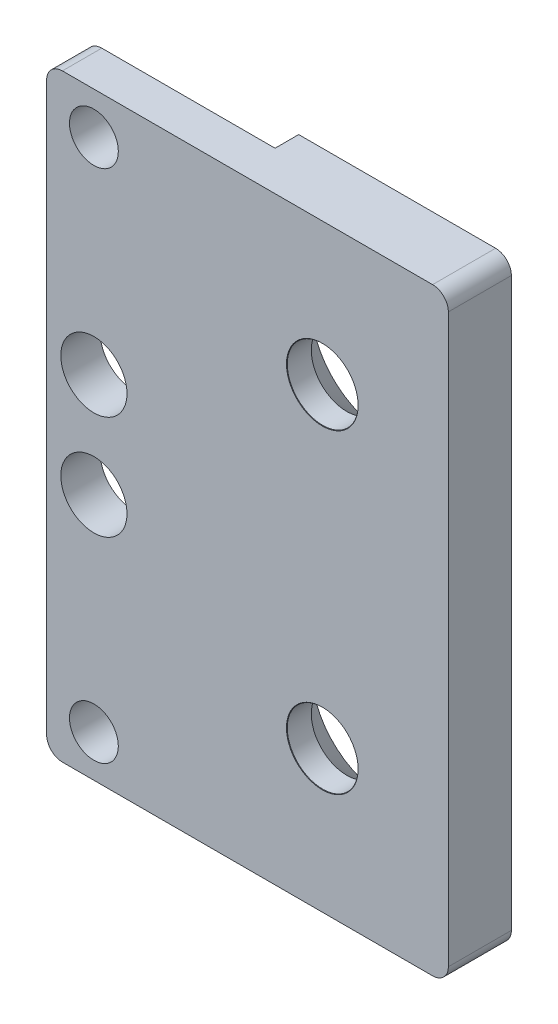
ISO-10303-21;
HEADER;
FILE_DESCRIPTION(('STEP AP214'),'2;1');
FILE_NAME('part.step','',(''),(''),'','','');
FILE_SCHEMA(('AUTOMOTIVE_DESIGN { 1 0 10303 214 1 1 1 1 }'));
ENDSEC;
DATA;
#1=APPLICATION_CONTEXT('core data for automotive mechanical design processes');
#2=APPLICATION_PROTOCOL_DEFINITION('international standard','automotive_design',2000,#1);
#3=PRODUCT_CONTEXT('',#1,'mechanical');
#4=PRODUCT('Part','Part','',(#3));
#5=PRODUCT_RELATED_PRODUCT_CATEGORY('part','',(#4));
#6=PRODUCT_DEFINITION_FORMATION('','',#4);
#7=PRODUCT_DEFINITION_CONTEXT('part definition',#1,'design');
#8=PRODUCT_DEFINITION('design','',#6,#7);
#9=PRODUCT_DEFINITION_SHAPE('','',#8);
#10=(LENGTH_UNIT() NAMED_UNIT(*) SI_UNIT(.MILLI.,.METRE.));
#11=(NAMED_UNIT(*) PLANE_ANGLE_UNIT() SI_UNIT($,.RADIAN.));
#12=(NAMED_UNIT(*) SI_UNIT($,.STERADIAN.) SOLID_ANGLE_UNIT());
#13=UNCERTAINTY_MEASURE_WITH_UNIT(LENGTH_MEASURE(1.E-05),#10,'distance_accuracy_value','');
#14=(GEOMETRIC_REPRESENTATION_CONTEXT(3) GLOBAL_UNCERTAINTY_ASSIGNED_CONTEXT((#13)) GLOBAL_UNIT_ASSIGNED_CONTEXT((#10,
#11,#12)) REPRESENTATION_CONTEXT('',''));
#15=CARTESIAN_POINT('',(0.,0.,0.));
#16=DIRECTION('',(0.,0.,1.));
#17=DIRECTION('',(1.,0.,0.));
#18=AXIS2_PLACEMENT_3D('',#15,#16,#17);
#19=CARTESIAN_POINT('',(-12.75,-19.001,1.5));
#20=DIRECTION('',(0.,0.,1.));
#21=DIRECTION('',(1.,0.,0.));
#22=AXIS2_PLACEMENT_3D('',#19,#20,#21);
#23=PLANE('',#22);
#24=CARTESIAN_POINT('',(-9.75,-3.3,1.5));
#25=DIRECTION('',(0.,0.,-1.));
#26=DIRECTION('',(-1.,0.,0.));
#27=AXIS2_PLACEMENT_3D('',#24,#25,#26);
#28=CIRCLE('',#27,2.10000000000001);
#29=CARTESIAN_POINT('',(-11.85,-3.3,1.5));
#30=VERTEX_POINT('',#29);
#31=EDGE_CURVE('E349',#30,#30,#28,.T.);
#32=ORIENTED_EDGE('',*,*,#31,.F.);
#33=EDGE_LOOP('',(#32));
#34=FACE_BOUND('',#33,.T.);
#35=CARTESIAN_POINT('',(-9.75,-16.35,1.5));
#36=DIRECTION('',(0.,0.,-1.));
#37=DIRECTION('',(-1.,0.,0.));
#38=AXIS2_PLACEMENT_3D('',#35,#36,#37);
#39=CIRCLE('',#38,1.55);
#40=CARTESIAN_POINT('',(-11.3,-16.35,1.5));
#41=VERTEX_POINT('',#40);
#42=EDGE_CURVE('E337',#41,#41,#39,.T.);
#43=ORIENTED_EDGE('',*,*,#42,.F.);
#44=EDGE_LOOP('',(#43));
#45=FACE_BOUND('',#44,.T.);
#46=CARTESIAN_POINT('',(-9.74999999999999,16.35,1.5));
#47=DIRECTION('',(0.,0.,-1.));
#48=DIRECTION('',(-1.,0.,0.));
#49=AXIS2_PLACEMENT_3D('',#46,#47,#48);
#50=CIRCLE('',#49,1.55);
#51=CARTESIAN_POINT('',(-11.3,16.35,1.5));
#52=VERTEX_POINT('',#51);
#53=EDGE_CURVE('E331',#52,#52,#50,.T.);
#54=ORIENTED_EDGE('',*,*,#53,.F.);
#55=EDGE_LOOP('',(#54));
#56=FACE_BOUND('',#55,.T.);
#57=DIRECTION('',(-1.,0.,0.));
#58=VECTOR('',#57,1.);
#59=CARTESIAN_POINT('',(-12.75,-19.,1.5));
#60=LINE('',#59,#58);
#61=CARTESIAN_POINT('',(-0.75,-19.,1.5));
#62=VERTEX_POINT('',#61);
#63=CARTESIAN_POINT('',(-11.75,-19.,1.5));
#64=VERTEX_POINT('',#63);
#65=EDGE_CURVE('E144',#62,#64,#60,.T.);
#66=ORIENTED_EDGE('',*,*,#65,.T.);
#67=CARTESIAN_POINT('',(-11.75,-18.,1.5));
#68=DIRECTION('',(0.,0.,1.));
#69=DIRECTION('',(1.,0.,0.));
#70=AXIS2_PLACEMENT_3D('',#67,#68,#69);
#71=CIRCLE('',#70,1.);
#72=CARTESIAN_POINT('',(-12.75,-18.,1.5));
#73=VERTEX_POINT('',#72);
#74=EDGE_CURVE('E171',#64,#73,#71,.F.);
#75=ORIENTED_EDGE('',*,*,#74,.T.);
#76=DIRECTION('',(0.,1.,0.));
#77=VECTOR('',#76,1.);
#78=CARTESIAN_POINT('',(-12.75,-19.001,1.5));
#79=LINE('',#78,#77);
#80=CARTESIAN_POINT('',(-12.75,18.,1.5));
#81=VERTEX_POINT('',#80);
#82=EDGE_CURVE('E135',#73,#81,#79,.T.);
#83=ORIENTED_EDGE('',*,*,#82,.T.);
#84=CARTESIAN_POINT('',(-11.75,18.,1.5));
#85=DIRECTION('',(0.,0.,1.));
#86=DIRECTION('',(1.,0.,0.));
#87=AXIS2_PLACEMENT_3D('',#84,#85,#86);
#88=CIRCLE('',#87,1.);
#89=CARTESIAN_POINT('',(-11.75,19.,1.5));
#90=VERTEX_POINT('',#89);
#91=EDGE_CURVE('E121',#81,#90,#88,.F.);
#92=ORIENTED_EDGE('',*,*,#91,.T.);
#93=DIRECTION('',(1.,0.,0.));
#94=VECTOR('',#93,1.);
#95=CARTESIAN_POINT('',(-12.75,19.,1.5));
#96=LINE('',#95,#94);
#97=CARTESIAN_POINT('',(-0.75,19.,1.5));
#98=VERTEX_POINT('',#97);
#99=EDGE_CURVE('E114',#90,#98,#96,.T.);
#100=ORIENTED_EDGE('',*,*,#99,.T.);
#101=DIRECTION('',(0.,1.,0.));
#102=VECTOR('',#101,1.);
#103=CARTESIAN_POINT('',(-0.75,-19.001,1.5));
#104=LINE('',#103,#102);
#105=EDGE_CURVE('E118',#62,#98,#104,.T.);
#106=ORIENTED_EDGE('',*,*,#105,.F.);
#107=EDGE_LOOP('',(#66,#75,#83,#92,#100,#106));
#108=FACE_BOUND('',#107,.T.);
#109=CARTESIAN_POINT('',(-9.75,3.3,1.5));
#110=DIRECTION('',(0.,0.,-1.));
#111=DIRECTION('',(-1.,0.,0.));
#112=AXIS2_PLACEMENT_3D('',#109,#110,#111);
#113=CIRCLE('',#112,2.10000000000001);
#114=CARTESIAN_POINT('',(-11.85,3.3,1.5));
#115=VERTEX_POINT('',#114);
#116=EDGE_CURVE('E343',#115,#115,#113,.T.);
#117=ORIENTED_EDGE('',*,*,#116,.F.);
#118=EDGE_LOOP('',(#117));
#119=FACE_BOUND('',#118,.T.);
#120=ADVANCED_FACE('F37',(#34,#45,#56,#108,#119),#23,.F.);
#121=CARTESIAN_POINT('',(0.,0.,0.));
#122=DIRECTION('',(0.,0.,1.));
#123=DIRECTION('',(1.,0.,0.));
#124=AXIS2_PLACEMENT_3D('',#121,#122,#123);
#125=PLANE('',#124);
#126=DIRECTION('',(-1.,0.,0.));
#127=VECTOR('',#126,1.);
#128=CARTESIAN_POINT('',(12.75,19.,0.));
#129=LINE('',#128,#127);
#130=CARTESIAN_POINT('',(11.75,19.,0.));
#131=VERTEX_POINT('',#130);
#132=CARTESIAN_POINT('',(-0.749999999999999,19.,0.));
#133=VERTEX_POINT('',#132);
#134=EDGE_CURVE('E139',#131,#133,#129,.T.);
#135=ORIENTED_EDGE('',*,*,#134,.F.);
#136=CARTESIAN_POINT('',(11.75,18.,0.));
#137=DIRECTION('',(0.,0.,1.));
#138=DIRECTION('',(1.,0.,0.));
#139=AXIS2_PLACEMENT_3D('',#136,#137,#138);
#140=CIRCLE('',#139,1.);
#141=CARTESIAN_POINT('',(12.75,18.,0.));
#142=VERTEX_POINT('',#141);
#143=EDGE_CURVE('E52',#131,#142,#140,.F.);
#144=ORIENTED_EDGE('',*,*,#143,.T.);
#145=DIRECTION('',(0.,1.,0.));
#146=VECTOR('',#145,1.);
#147=CARTESIAN_POINT('',(12.75,-19.,0.));
#148=LINE('',#147,#146);
#149=CARTESIAN_POINT('',(12.75,-18.,0.));
#150=VERTEX_POINT('',#149);
#151=EDGE_CURVE('E163',#150,#142,#148,.T.);
#152=ORIENTED_EDGE('',*,*,#151,.F.);
#153=CARTESIAN_POINT('',(11.75,-18.,0.));
#154=DIRECTION('',(0.,0.,1.));
#155=DIRECTION('',(1.,0.,0.));
#156=AXIS2_PLACEMENT_3D('',#153,#154,#155);
#157=CIRCLE('',#156,1.);
#158=CARTESIAN_POINT('',(11.75,-19.,0.));
#159=VERTEX_POINT('',#158);
#160=EDGE_CURVE('E60',#150,#159,#157,.F.);
#161=ORIENTED_EDGE('',*,*,#160,.T.);
#162=DIRECTION('',(1.,0.,0.));
#163=VECTOR('',#162,1.);
#164=CARTESIAN_POINT('',(12.75,-19.,0.));
#165=LINE('',#164,#163);
#166=CARTESIAN_POINT('',(-0.75,-19.,0.));
#167=VERTEX_POINT('',#166);
#168=EDGE_CURVE('E147',#167,#159,#165,.T.);
#169=ORIENTED_EDGE('',*,*,#168,.F.);
#170=DIRECTION('',(0.,1.,0.));
#171=VECTOR('',#170,1.);
#172=CARTESIAN_POINT('',(-0.75,-19.001,0.));
#173=LINE('',#172,#171);
#174=EDGE_CURVE('E134',#167,#133,#173,.T.);
#175=ORIENTED_EDGE('',*,*,#174,.T.);
#176=EDGE_LOOP('',(#135,#144,#152,#161,#169,#175));
#177=FACE_BOUND('',#176,.T.);
#178=CARTESIAN_POINT('',(4.75,-10.,0.));
#179=DIRECTION('',(0.,0.,-1.));
#180=DIRECTION('',(-1.,0.,0.));
#181=AXIS2_PLACEMENT_3D('',#178,#179,#180);
#182=CIRCLE('',#181,4.7);
#183=CARTESIAN_POINT('',(0.0500000000000014,-10.,0.));
#184=VERTEX_POINT('',#183);
#185=EDGE_CURVE('E310',#184,#184,#182,.T.);
#186=ORIENTED_EDGE('',*,*,#185,.F.);
#187=EDGE_LOOP('',(#186));
#188=FACE_BOUND('',#187,.T.);
#189=CARTESIAN_POINT('',(4.75,10.,0.));
#190=DIRECTION('',(0.,0.,-1.));
#191=DIRECTION('',(-1.,0.,0.));
#192=AXIS2_PLACEMENT_3D('',#189,#190,#191);
#193=CIRCLE('',#192,4.7);
#194=CARTESIAN_POINT('',(0.0500000000000014,10.,0.));
#195=VERTEX_POINT('',#194);
#196=EDGE_CURVE('E322',#195,#195,#193,.T.);
#197=ORIENTED_EDGE('',*,*,#196,.F.);
#198=EDGE_LOOP('',(#197));
#199=FACE_BOUND('',#198,.T.);
#200=ADVANCED_FACE('F196',(#177,#188,#199),#125,.F.);
#201=CARTESIAN_POINT('',(-12.75,-19.,4.));
#202=DIRECTION('',(1.,0.,0.));
#203=DIRECTION('',(0.,0.,-1.));
#204=AXIS2_PLACEMENT_3D('',#201,#202,#203);
#205=PLANE('',#204);
#206=ORIENTED_EDGE('',*,*,#82,.F.);
#207=DIRECTION('',(0.,0.,-1.));
#208=VECTOR('',#207,1.);
#209=CARTESIAN_POINT('',(-12.75,-18.,4.));
#210=LINE('',#209,#208);
#211=CARTESIAN_POINT('',(-12.75,-18.,4.));
#212=VERTEX_POINT('',#211);
#213=EDGE_CURVE('E176',#73,#212,#210,.F.);
#214=ORIENTED_EDGE('',*,*,#213,.T.);
#215=DIRECTION('',(0.,-1.,0.));
#216=VECTOR('',#215,1.);
#217=CARTESIAN_POINT('',(-12.75,-19.,4.));
#218=LINE('',#217,#216);
#219=CARTESIAN_POINT('',(-12.75,18.,4.));
#220=VERTEX_POINT('',#219);
#221=EDGE_CURVE('E148',#220,#212,#218,.T.);
#222=ORIENTED_EDGE('',*,*,#221,.F.);
#223=DIRECTION('',(0.,0.,-1.));
#224=VECTOR('',#223,1.);
#225=CARTESIAN_POINT('',(-12.75,18.,4.));
#226=LINE('',#225,#224);
#227=EDGE_CURVE('E173',#220,#81,#226,.T.);
#228=ORIENTED_EDGE('',*,*,#227,.T.);
#229=EDGE_LOOP('',(#206,#214,#222,#228));
#230=FACE_BOUND('',#229,.T.);
#231=ADVANCED_FACE('F212',(#230),#205,.F.);
#232=CARTESIAN_POINT('',(12.75,-19.,4.));
#233=DIRECTION('',(0.,1.,0.));
#234=DIRECTION('',(-1.,0.,0.));
#235=AXIS2_PLACEMENT_3D('',#232,#233,#234);
#236=PLANE('',#235);
#237=DIRECTION('',(1.,0.,0.));
#238=VECTOR('',#237,1.);
#239=CARTESIAN_POINT('',(12.75,-19.,4.));
#240=LINE('',#239,#238);
#241=CARTESIAN_POINT('',(-11.75,-19.,4.));
#242=VERTEX_POINT('',#241);
#243=CARTESIAN_POINT('',(11.75,-19.,4.));
#244=VERTEX_POINT('',#243);
#245=EDGE_CURVE('E151',#242,#244,#240,.T.);
#246=ORIENTED_EDGE('',*,*,#245,.F.);
#247=DIRECTION('',(0.,0.,-1.));
#248=VECTOR('',#247,1.);
#249=CARTESIAN_POINT('',(-11.75,-19.,4.));
#250=LINE('',#249,#248);
#251=EDGE_CURVE('E167',#242,#64,#250,.T.);
#252=ORIENTED_EDGE('',*,*,#251,.T.);
#253=ORIENTED_EDGE('',*,*,#65,.F.);
#254=DIRECTION('',(0.,0.,1.));
#255=VECTOR('',#254,1.);
#256=CARTESIAN_POINT('',(-0.75,-19.,0.));
#257=LINE('',#256,#255);
#258=EDGE_CURVE('E126',#167,#62,#257,.T.);
#259=ORIENTED_EDGE('',*,*,#258,.F.);
#260=ORIENTED_EDGE('',*,*,#168,.T.);
#261=DIRECTION('',(0.,0.,-1.));
#262=VECTOR('',#261,1.);
#263=CARTESIAN_POINT('',(11.75,-19.,4.));
#264=LINE('',#263,#262);
#265=EDGE_CURVE('E160',#159,#244,#264,.F.);
#266=ORIENTED_EDGE('',*,*,#265,.T.);
#267=EDGE_LOOP('',(#246,#252,#253,#259,#260,#266));
#268=FACE_BOUND('',#267,.T.);
#269=ADVANCED_FACE('F201',(#268),#236,.F.);
#270=CARTESIAN_POINT('',(12.75,-19.,4.));
#271=DIRECTION('',(-1.,0.,0.));
#272=DIRECTION('',(0.,0.,1.));
#273=AXIS2_PLACEMENT_3D('',#270,#271,#272);
#274=PLANE('',#273);
#275=ORIENTED_EDGE('',*,*,#151,.T.);
#276=DIRECTION('',(0.,0.,-1.));
#277=VECTOR('',#276,1.);
#278=CARTESIAN_POINT('',(12.75,18.,4.));
#279=LINE('',#278,#277);
#280=CARTESIAN_POINT('',(12.75,18.,4.));
#281=VERTEX_POINT('',#280);
#282=EDGE_CURVE('E11',#142,#281,#279,.F.);
#283=ORIENTED_EDGE('',*,*,#282,.T.);
#284=DIRECTION('',(0.,1.,0.));
#285=VECTOR('',#284,1.);
#286=CARTESIAN_POINT('',(12.75,-19.,4.));
#287=LINE('',#286,#285);
#288=CARTESIAN_POINT('',(12.75,-18.,4.));
#289=VERTEX_POINT('',#288);
#290=EDGE_CURVE('E154',#289,#281,#287,.T.);
#291=ORIENTED_EDGE('',*,*,#290,.F.);
#292=DIRECTION('',(0.,0.,-1.));
#293=VECTOR('',#292,1.);
#294=CARTESIAN_POINT('',(12.75,-18.,4.));
#295=LINE('',#294,#293);
#296=EDGE_CURVE('E45',#289,#150,#295,.T.);
#297=ORIENTED_EDGE('',*,*,#296,.T.);
#298=EDGE_LOOP('',(#275,#283,#291,#297));
#299=FACE_BOUND('',#298,.T.);
#300=ADVANCED_FACE('F193',(#299),#274,.F.);
#301=CARTESIAN_POINT('',(12.75,19.,4.));
#302=DIRECTION('',(0.,-1.,0.));
#303=DIRECTION('',(1.,0.,0.));
#304=AXIS2_PLACEMENT_3D('',#301,#302,#303);
#305=PLANE('',#304);
#306=ORIENTED_EDGE('',*,*,#99,.F.);
#307=DIRECTION('',(0.,0.,-1.));
#308=VECTOR('',#307,1.);
#309=CARTESIAN_POINT('',(-11.75,19.,4.));
#310=LINE('',#309,#308);
#311=CARTESIAN_POINT('',(-11.75,19.,4.));
#312=VERTEX_POINT('',#311);
#313=EDGE_CURVE('E188',#90,#312,#310,.F.);
#314=ORIENTED_EDGE('',*,*,#313,.T.);
#315=DIRECTION('',(-1.,0.,0.));
#316=VECTOR('',#315,1.);
#317=CARTESIAN_POINT('',(12.75,19.,4.));
#318=LINE('',#317,#316);
#319=CARTESIAN_POINT('',(11.75,19.,4.));
#320=VERTEX_POINT('',#319);
#321=EDGE_CURVE('E157',#320,#312,#318,.T.);
#322=ORIENTED_EDGE('',*,*,#321,.F.);
#323=DIRECTION('',(0.,0.,-1.));
#324=VECTOR('',#323,1.);
#325=CARTESIAN_POINT('',(11.75,19.,4.));
#326=LINE('',#325,#324);
#327=EDGE_CURVE('E186',#320,#131,#326,.T.);
#328=ORIENTED_EDGE('',*,*,#327,.T.);
#329=ORIENTED_EDGE('',*,*,#134,.T.);
#330=DIRECTION('',(0.,0.,-1.));
#331=VECTOR('',#330,1.);
#332=CARTESIAN_POINT('',(-0.75,19.,0.));
#333=LINE('',#332,#331);
#334=EDGE_CURVE('E125',#98,#133,#333,.T.);
#335=ORIENTED_EDGE('',*,*,#334,.F.);
#336=EDGE_LOOP('',(#306,#314,#322,#328,#329,#335));
#337=FACE_BOUND('',#336,.T.);
#338=ADVANCED_FACE('F137',(#337),#305,.F.);
#339=CARTESIAN_POINT('',(0.,0.,4.));
#340=DIRECTION('',(0.,0.,1.));
#341=DIRECTION('',(1.,0.,0.));
#342=AXIS2_PLACEMENT_3D('',#339,#340,#341);
#343=PLANE('',#342);
#344=CARTESIAN_POINT('',(-9.75,-3.3,4.));
#345=DIRECTION('',(0.,0.,1.));
#346=DIRECTION('',(1.,0.,0.));
#347=AXIS2_PLACEMENT_3D('',#344,#345,#346);
#348=CIRCLE('',#347,2.10000000000001);
#349=CARTESIAN_POINT('',(-7.64999999999999,-3.3,4.));
#350=VERTEX_POINT('',#349);
#351=EDGE_CURVE('E346',#350,#350,#348,.T.);
#352=ORIENTED_EDGE('',*,*,#351,.F.);
#353=EDGE_LOOP('',(#352));
#354=FACE_BOUND('',#353,.T.);
#355=CARTESIAN_POINT('',(-9.75,3.3,4.));
#356=DIRECTION('',(0.,0.,1.));
#357=DIRECTION('',(1.,0.,0.));
#358=AXIS2_PLACEMENT_3D('',#355,#356,#357);
#359=CIRCLE('',#358,2.10000000000001);
#360=CARTESIAN_POINT('',(-7.64999999999999,3.3,4.));
#361=VERTEX_POINT('',#360);
#362=EDGE_CURVE('E340',#361,#361,#359,.T.);
#363=ORIENTED_EDGE('',*,*,#362,.F.);
#364=EDGE_LOOP('',(#363));
#365=FACE_BOUND('',#364,.T.);
#366=CARTESIAN_POINT('',(-9.75,-16.35,4.));
#367=DIRECTION('',(0.,0.,1.));
#368=DIRECTION('',(1.,0.,0.));
#369=AXIS2_PLACEMENT_3D('',#366,#367,#368);
#370=CIRCLE('',#369,1.55);
#371=CARTESIAN_POINT('',(-8.2,-16.35,4.));
#372=VERTEX_POINT('',#371);
#373=EDGE_CURVE('E334',#372,#372,#370,.T.);
#374=ORIENTED_EDGE('',*,*,#373,.F.);
#375=EDGE_LOOP('',(#374));
#376=FACE_BOUND('',#375,.T.);
#377=CARTESIAN_POINT('',(-9.74999999999999,16.35,4.));
#378=DIRECTION('',(0.,0.,1.));
#379=DIRECTION('',(1.,0.,0.));
#380=AXIS2_PLACEMENT_3D('',#377,#378,#379);
#381=CIRCLE('',#380,1.55);
#382=CARTESIAN_POINT('',(-8.2,16.35,4.));
#383=VERTEX_POINT('',#382);
#384=EDGE_CURVE('E328',#383,#383,#381,.T.);
#385=ORIENTED_EDGE('',*,*,#384,.F.);
#386=EDGE_LOOP('',(#385));
#387=FACE_BOUND('',#386,.T.);
#388=CARTESIAN_POINT('',(4.75,10.,4.));
#389=DIRECTION('',(0.,0.,-1.));
#390=DIRECTION('',(-1.,0.,0.));
#391=AXIS2_PLACEMENT_3D('',#388,#389,#390);
#392=CIRCLE('',#391,2.275);
#393=CARTESIAN_POINT('',(2.475,10.,4.));
#394=VERTEX_POINT('',#393);
#395=EDGE_CURVE('E325',#394,#394,#392,.T.);
#396=ORIENTED_EDGE('',*,*,#395,.T.);
#397=EDGE_LOOP('',(#396));
#398=FACE_BOUND('',#397,.T.);
#399=CARTESIAN_POINT('',(4.75,-10.,4.));
#400=DIRECTION('',(0.,0.,-1.));
#401=DIRECTION('',(-1.,0.,0.));
#402=AXIS2_PLACEMENT_3D('',#399,#400,#401);
#403=CIRCLE('',#402,2.275);
#404=CARTESIAN_POINT('',(2.475,-10.,4.));
#405=VERTEX_POINT('',#404);
#406=EDGE_CURVE('E303',#405,#405,#403,.T.);
#407=ORIENTED_EDGE('',*,*,#406,.T.);
#408=EDGE_LOOP('',(#407));
#409=FACE_BOUND('',#408,.T.);
#410=ORIENTED_EDGE('',*,*,#221,.T.);
#411=CARTESIAN_POINT('',(-11.75,-18.,4.));
#412=DIRECTION('',(0.,0.,1.));
#413=DIRECTION('',(1.,0.,0.));
#414=AXIS2_PLACEMENT_3D('',#411,#412,#413);
#415=CIRCLE('',#414,1.);
#416=EDGE_CURVE('E184',#212,#242,#415,.T.);
#417=ORIENTED_EDGE('',*,*,#416,.T.);
#418=ORIENTED_EDGE('',*,*,#245,.T.);
#419=CARTESIAN_POINT('',(11.75,-18.,4.));
#420=DIRECTION('',(0.,0.,1.));
#421=DIRECTION('',(1.,0.,0.));
#422=AXIS2_PLACEMENT_3D('',#419,#420,#421);
#423=CIRCLE('',#422,1.);
#424=EDGE_CURVE('E178',#244,#289,#423,.T.);
#425=ORIENTED_EDGE('',*,*,#424,.T.);
#426=ORIENTED_EDGE('',*,*,#290,.T.);
#427=CARTESIAN_POINT('',(11.75,18.,4.));
#428=DIRECTION('',(0.,0.,1.));
#429=DIRECTION('',(1.,0.,0.));
#430=AXIS2_PLACEMENT_3D('',#427,#428,#429);
#431=CIRCLE('',#430,1.);
#432=EDGE_CURVE('E180',#281,#320,#431,.T.);
#433=ORIENTED_EDGE('',*,*,#432,.T.);
#434=ORIENTED_EDGE('',*,*,#321,.T.);
#435=CARTESIAN_POINT('',(-11.75,18.,4.));
#436=DIRECTION('',(0.,0.,1.));
#437=DIRECTION('',(1.,0.,0.));
#438=AXIS2_PLACEMENT_3D('',#435,#436,#437);
#439=CIRCLE('',#438,1.);
#440=EDGE_CURVE('E182',#312,#220,#439,.T.);
#441=ORIENTED_EDGE('',*,*,#440,.T.);
#442=EDGE_LOOP('',(#410,#417,#418,#425,#426,#433,#434,#441));
#443=FACE_BOUND('',#442,.T.);
#444=ADVANCED_FACE('F203',(#354,#365,#376,#387,#398,#409,#443),#343,.T.);
#445=CARTESIAN_POINT('',(-0.75,-19.001,0.));
#446=DIRECTION('',(1.,0.,0.));
#447=DIRECTION('',(0.,0.,-1.));
#448=AXIS2_PLACEMENT_3D('',#445,#446,#447);
#449=PLANE('',#448);
#450=ORIENTED_EDGE('',*,*,#258,.T.);
#451=ORIENTED_EDGE('',*,*,#105,.T.);
#452=ORIENTED_EDGE('',*,*,#334,.T.);
#453=ORIENTED_EDGE('',*,*,#174,.F.);
#454=EDGE_LOOP('',(#450,#451,#452,#453));
#455=FACE_BOUND('',#454,.T.);
#456=ADVANCED_FACE('F130',(#455),#449,.F.);
#457=CARTESIAN_POINT('',(4.75,-10.,3.975));
#458=DIRECTION('',(0.,0.,1.));
#459=DIRECTION('',(1.,0.,0.));
#460=AXIS2_PLACEMENT_3D('',#457,#458,#459);
#461=CONICAL_SURFACE('',#460,2.25,0.785398163397448);
#462=ORIENTED_EDGE('',*,*,#406,.F.);
#463=EDGE_LOOP('',(#462));
#464=FACE_BOUND('',#463,.T.);
#465=CARTESIAN_POINT('',(4.75,-10.,3.975));
#466=DIRECTION('',(0.,0.,-1.));
#467=DIRECTION('',(-1.,0.,0.));
#468=AXIS2_PLACEMENT_3D('',#465,#466,#467);
#469=CIRCLE('',#468,2.25);
#470=CARTESIAN_POINT('',(2.5,-10.,3.975));
#471=VERTEX_POINT('',#470);
#472=EDGE_CURVE('E306',#471,#471,#469,.T.);
#473=ORIENTED_EDGE('',*,*,#472,.T.);
#474=EDGE_LOOP('',(#473));
#475=FACE_BOUND('',#474,.T.);
#476=ADVANCED_FACE('F293',(#464,#475),#461,.F.);
#477=CARTESIAN_POINT('',(4.75,-10.,0.));
#478=DIRECTION('',(0.,0.,-1.));
#479=DIRECTION('',(-1.,0.,0.));
#480=AXIS2_PLACEMENT_3D('',#477,#478,#479);
#481=CYLINDRICAL_SURFACE('',#480,2.25);
#482=ORIENTED_EDGE('',*,*,#472,.F.);
#483=EDGE_LOOP('',(#482));
#484=FACE_BOUND('',#483,.T.);
#485=CARTESIAN_POINT('',(4.75,-10.,2.45));
#486=DIRECTION('',(0.,0.,-1.));
#487=DIRECTION('',(-1.,0.,0.));
#488=AXIS2_PLACEMENT_3D('',#485,#486,#487);
#489=CIRCLE('',#488,2.25);
#490=CARTESIAN_POINT('',(2.5,-10.,2.45));
#491=VERTEX_POINT('',#490);
#492=EDGE_CURVE('E307',#491,#491,#489,.T.);
#493=ORIENTED_EDGE('',*,*,#492,.T.);
#494=EDGE_LOOP('',(#493));
#495=FACE_BOUND('',#494,.T.);
#496=ADVANCED_FACE('F290',(#484,#495),#481,.F.);
#497=CARTESIAN_POINT('',(4.75,-10.,0.));
#498=DIRECTION('',(0.,0.,-1.));
#499=DIRECTION('',(-1.,0.,0.));
#500=AXIS2_PLACEMENT_3D('',#497,#498,#499);
#501=CONICAL_SURFACE('',#500,4.7,0.785398163397449);
#502=ORIENTED_EDGE('',*,*,#492,.F.);
#503=EDGE_LOOP('',(#502));
#504=FACE_BOUND('',#503,.T.);
#505=ORIENTED_EDGE('',*,*,#185,.T.);
#506=EDGE_LOOP('',(#505));
#507=FACE_BOUND('',#506,.T.);
#508=ADVANCED_FACE('F286',(#504,#507),#501,.F.);
#509=CARTESIAN_POINT('',(4.75,10.,3.975));
#510=DIRECTION('',(0.,0.,1.));
#511=DIRECTION('',(1.,0.,0.));
#512=AXIS2_PLACEMENT_3D('',#509,#510,#511);
#513=CONICAL_SURFACE('',#512,2.25,0.785398163397448);
#514=ORIENTED_EDGE('',*,*,#395,.F.);
#515=EDGE_LOOP('',(#514));
#516=FACE_BOUND('',#515,.T.);
#517=CARTESIAN_POINT('',(4.75,10.,3.975));
#518=DIRECTION('',(0.,0.,-1.));
#519=DIRECTION('',(-1.,0.,0.));
#520=AXIS2_PLACEMENT_3D('',#517,#518,#519);
#521=CIRCLE('',#520,2.25);
#522=CARTESIAN_POINT('',(2.5,10.,3.975));
#523=VERTEX_POINT('',#522);
#524=EDGE_CURVE('E316',#523,#523,#521,.T.);
#525=ORIENTED_EDGE('',*,*,#524,.T.);
#526=EDGE_LOOP('',(#525));
#527=FACE_BOUND('',#526,.T.);
#528=ADVANCED_FACE('F282',(#516,#527),#513,.F.);
#529=CARTESIAN_POINT('',(4.75,10.,0.));
#530=DIRECTION('',(0.,0.,-1.));
#531=DIRECTION('',(-1.,0.,0.));
#532=AXIS2_PLACEMENT_3D('',#529,#530,#531);
#533=CYLINDRICAL_SURFACE('',#532,2.25);
#534=ORIENTED_EDGE('',*,*,#524,.F.);
#535=EDGE_LOOP('',(#534));
#536=FACE_BOUND('',#535,.T.);
#537=CARTESIAN_POINT('',(4.75,10.,2.45));
#538=DIRECTION('',(0.,0.,-1.));
#539=DIRECTION('',(-1.,0.,0.));
#540=AXIS2_PLACEMENT_3D('',#537,#538,#539);
#541=CIRCLE('',#540,2.25);
#542=CARTESIAN_POINT('',(2.5,10.,2.45));
#543=VERTEX_POINT('',#542);
#544=EDGE_CURVE('E319',#543,#543,#541,.T.);
#545=ORIENTED_EDGE('',*,*,#544,.T.);
#546=EDGE_LOOP('',(#545));
#547=FACE_BOUND('',#546,.T.);
#548=ADVANCED_FACE('F278',(#536,#547),#533,.F.);
#549=CARTESIAN_POINT('',(4.75,10.,0.));
#550=DIRECTION('',(0.,0.,-1.));
#551=DIRECTION('',(-1.,0.,0.));
#552=AXIS2_PLACEMENT_3D('',#549,#550,#551);
#553=CONICAL_SURFACE('',#552,4.7,0.785398163397449);
#554=ORIENTED_EDGE('',*,*,#544,.F.);
#555=EDGE_LOOP('',(#554));
#556=FACE_BOUND('',#555,.T.);
#557=ORIENTED_EDGE('',*,*,#196,.T.);
#558=EDGE_LOOP('',(#557));
#559=FACE_BOUND('',#558,.T.);
#560=ADVANCED_FACE('F274',(#556,#559),#553,.F.);
#561=CARTESIAN_POINT('',(-9.74999999999999,16.35,1.5));
#562=DIRECTION('',(0.,0.,-1.));
#563=DIRECTION('',(-1.,0.,0.));
#564=AXIS2_PLACEMENT_3D('',#561,#562,#563);
#565=CYLINDRICAL_SURFACE('',#564,1.55);
#566=ORIENTED_EDGE('',*,*,#53,.T.);
#567=EDGE_LOOP('',(#566));
#568=FACE_BOUND('',#567,.T.);
#569=ORIENTED_EDGE('',*,*,#384,.T.);
#570=EDGE_LOOP('',(#569));
#571=FACE_BOUND('',#570,.T.);
#572=ADVANCED_FACE('F270',(#568,#571),#565,.F.);
#573=CARTESIAN_POINT('',(-9.75,-16.35,1.5));
#574=DIRECTION('',(0.,0.,-1.));
#575=DIRECTION('',(-1.,0.,0.));
#576=AXIS2_PLACEMENT_3D('',#573,#574,#575);
#577=CYLINDRICAL_SURFACE('',#576,1.55);
#578=ORIENTED_EDGE('',*,*,#42,.T.);
#579=EDGE_LOOP('',(#578));
#580=FACE_BOUND('',#579,.T.);
#581=ORIENTED_EDGE('',*,*,#373,.T.);
#582=EDGE_LOOP('',(#581));
#583=FACE_BOUND('',#582,.T.);
#584=ADVANCED_FACE('F262',(#580,#583),#577,.F.);
#585=CARTESIAN_POINT('',(-9.75,3.3,1.5));
#586=DIRECTION('',(0.,0.,-1.));
#587=DIRECTION('',(-1.,0.,0.));
#588=AXIS2_PLACEMENT_3D('',#585,#586,#587);
#589=CYLINDRICAL_SURFACE('',#588,2.10000000000001);
#590=ORIENTED_EDGE('',*,*,#116,.T.);
#591=EDGE_LOOP('',(#590));
#592=FACE_BOUND('',#591,.T.);
#593=ORIENTED_EDGE('',*,*,#362,.T.);
#594=EDGE_LOOP('',(#593));
#595=FACE_BOUND('',#594,.T.);
#596=ADVANCED_FACE('F256',(#592,#595),#589,.F.);
#597=CARTESIAN_POINT('',(-9.75,-3.3,1.5));
#598=DIRECTION('',(0.,0.,-1.));
#599=DIRECTION('',(-1.,0.,0.));
#600=AXIS2_PLACEMENT_3D('',#597,#598,#599);
#601=CYLINDRICAL_SURFACE('',#600,2.10000000000001);
#602=ORIENTED_EDGE('',*,*,#31,.T.);
#603=EDGE_LOOP('',(#602));
#604=FACE_BOUND('',#603,.T.);
#605=ORIENTED_EDGE('',*,*,#351,.T.);
#606=EDGE_LOOP('',(#605));
#607=FACE_BOUND('',#606,.T.);
#608=ADVANCED_FACE('F252',(#604,#607),#601,.F.);
#609=CARTESIAN_POINT('',(-11.75,-18.,4.));
#610=DIRECTION('',(0.,0.,-1.));
#611=DIRECTION('',(-1.,0.,0.));
#612=AXIS2_PLACEMENT_3D('',#609,#610,#611);
#613=CYLINDRICAL_SURFACE('',#612,1.);
#614=ORIENTED_EDGE('',*,*,#416,.F.);
#615=ORIENTED_EDGE('',*,*,#213,.F.);
#616=ORIENTED_EDGE('',*,*,#74,.F.);
#617=ORIENTED_EDGE('',*,*,#251,.F.);
#618=EDGE_LOOP('',(#614,#615,#616,#617));
#619=FACE_BOUND('',#618,.T.);
#620=ADVANCED_FACE('F208',(#619),#613,.T.);
#621=CARTESIAN_POINT('',(-11.75,18.,4.));
#622=DIRECTION('',(0.,0.,-1.));
#623=DIRECTION('',(-1.,0.,0.));
#624=AXIS2_PLACEMENT_3D('',#621,#622,#623);
#625=CYLINDRICAL_SURFACE('',#624,1.);
#626=ORIENTED_EDGE('',*,*,#440,.F.);
#627=ORIENTED_EDGE('',*,*,#313,.F.);
#628=ORIENTED_EDGE('',*,*,#91,.F.);
#629=ORIENTED_EDGE('',*,*,#227,.F.);
#630=EDGE_LOOP('',(#626,#627,#628,#629));
#631=FACE_BOUND('',#630,.T.);
#632=ADVANCED_FACE('F217',(#631),#625,.T.);
#633=CARTESIAN_POINT('',(11.75,18.,4.));
#634=DIRECTION('',(0.,0.,-1.));
#635=DIRECTION('',(-1.,0.,0.));
#636=AXIS2_PLACEMENT_3D('',#633,#634,#635);
#637=CYLINDRICAL_SURFACE('',#636,1.);
#638=ORIENTED_EDGE('',*,*,#432,.F.);
#639=ORIENTED_EDGE('',*,*,#282,.F.);
#640=ORIENTED_EDGE('',*,*,#143,.F.);
#641=ORIENTED_EDGE('',*,*,#327,.F.);
#642=EDGE_LOOP('',(#638,#639,#640,#641));
#643=FACE_BOUND('',#642,.T.);
#644=ADVANCED_FACE('F221',(#643),#637,.T.);
#645=CARTESIAN_POINT('',(11.75,-18.,4.));
#646=DIRECTION('',(0.,0.,-1.));
#647=DIRECTION('',(-1.,0.,0.));
#648=AXIS2_PLACEMENT_3D('',#645,#646,#647);
#649=CYLINDRICAL_SURFACE('',#648,1.);
#650=ORIENTED_EDGE('',*,*,#424,.F.);
#651=ORIENTED_EDGE('',*,*,#265,.F.);
#652=ORIENTED_EDGE('',*,*,#160,.F.);
#653=ORIENTED_EDGE('',*,*,#296,.F.);
#654=EDGE_LOOP('',(#650,#651,#652,#653));
#655=FACE_BOUND('',#654,.T.);
#656=ADVANCED_FACE('F39',(#655),#649,.T.);
#657=CLOSED_SHELL('',(#120,#200,#231,#269,#300,#338,#444,#456,#476,#496,#508,#528,#548,#560,
#572,#584,#596,#608,#620,#632,#644,#656));
#658=MANIFOLD_SOLID_BREP('B2',#657);
#659=ADVANCED_BREP_SHAPE_REPRESENTATION('',(#18,#658),#14);
#660=SHAPE_DEFINITION_REPRESENTATION(#9,#659);
ENDSEC;
END-ISO-10303-21;
